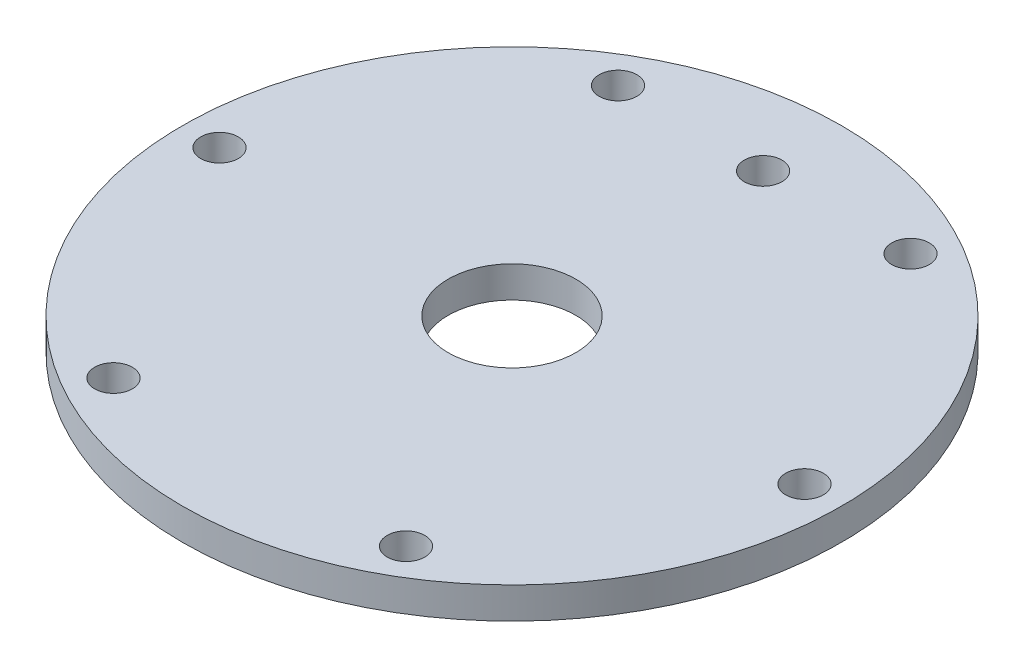
ISO-10303-21;
HEADER;
FILE_DESCRIPTION(('STEP AP214'),'2;1');
FILE_NAME('part.step','',(''),(''),'','','');
FILE_SCHEMA(('AUTOMOTIVE_DESIGN { 1 0 10303 214 1 1 1 1 }'));
ENDSEC;
DATA;
#1=APPLICATION_CONTEXT('core data for automotive mechanical design processes');
#2=APPLICATION_PROTOCOL_DEFINITION('international standard','automotive_design',2000,#1);
#3=PRODUCT_CONTEXT('',#1,'mechanical');
#4=PRODUCT('Part','Part','',(#3));
#5=PRODUCT_RELATED_PRODUCT_CATEGORY('part','',(#4));
#6=PRODUCT_DEFINITION_FORMATION('','',#4);
#7=PRODUCT_DEFINITION_CONTEXT('part definition',#1,'design');
#8=PRODUCT_DEFINITION('design','',#6,#7);
#9=PRODUCT_DEFINITION_SHAPE('','',#8);
#10=(LENGTH_UNIT() NAMED_UNIT(*) SI_UNIT(.MILLI.,.METRE.));
#11=(NAMED_UNIT(*) PLANE_ANGLE_UNIT() SI_UNIT($,.RADIAN.));
#12=(NAMED_UNIT(*) SI_UNIT($,.STERADIAN.) SOLID_ANGLE_UNIT());
#13=UNCERTAINTY_MEASURE_WITH_UNIT(LENGTH_MEASURE(1.E-05),#10,'distance_accuracy_value','');
#14=(GEOMETRIC_REPRESENTATION_CONTEXT(3) GLOBAL_UNCERTAINTY_ASSIGNED_CONTEXT((#13)) GLOBAL_UNIT_ASSIGNED_CONTEXT((#10,
#11,#12)) REPRESENTATION_CONTEXT('',''));
#15=CARTESIAN_POINT('',(0.,0.,0.));
#16=DIRECTION('',(0.,0.,1.));
#17=DIRECTION('',(1.,0.,0.));
#18=AXIS2_PLACEMENT_3D('',#15,#16,#17);
#19=CARTESIAN_POINT('',(0.,10.,0.));
#20=DIRECTION('',(0.,1.,0.));
#21=DIRECTION('',(0.,0.,1.));
#22=AXIS2_PLACEMENT_3D('',#19,#20,#21);
#23=PLANE('',#22);
#24=CARTESIAN_POINT('',(0.,10.,-80.));
#25=DIRECTION('',(0.,1.,0.));
#26=DIRECTION('',(0.,0.,1.));
#27=AXIS2_PLACEMENT_3D('',#24,#25,#26);
#28=CIRCLE('',#27,6.00000000000001);
#29=CARTESIAN_POINT('',(0.,10.,-74.));
#30=VERTEX_POINT('',#29);
#31=EDGE_CURVE('E90',#30,#30,#28,.T.);
#32=ORIENTED_EDGE('',*,*,#31,.F.);
#33=EDGE_LOOP('',(#32));
#34=FACE_BOUND('',#33,.T.);
#35=CARTESIAN_POINT('',(-93.0015510100497,10.,0.192929613181632));
#36=DIRECTION('',(0.,1.,0.));
#37=DIRECTION('',(0.86602540378444,0.,0.499999999999998));
#38=AXIS2_PLACEMENT_3D('',#35,#36,#37);
#39=CIRCLE('',#38,6.00000000000116);
#40=CARTESIAN_POINT('',(-87.8053985873421,10.,3.1929296131822));
#41=VERTEX_POINT('',#40);
#42=EDGE_CURVE('E85',#41,#41,#39,.T.);
#43=ORIENTED_EDGE('',*,*,#42,.F.);
#44=EDGE_LOOP('',(#43));
#45=FACE_BOUND('',#44,.T.);
#46=CARTESIAN_POINT('',(46.6678574511857,10.,80.4452409594724));
#47=DIRECTION('',(0.,1.,0.));
#48=DIRECTION('',(0.86602540378444,0.,0.499999999999998));
#49=AXIS2_PLACEMENT_3D('',#46,#47,#48);
#50=CIRCLE('',#49,5.99999999999494);
#51=CARTESIAN_POINT('',(51.864009873888,10.,83.4452409594699));
#52=VERTEX_POINT('',#51);
#53=EDGE_CURVE('E78',#52,#52,#50,.T.);
#54=ORIENTED_EDGE('',*,*,#53,.F.);
#55=EDGE_LOOP('',(#54));
#56=FACE_BOUND('',#55,.T.);
#57=CARTESIAN_POINT('',(46.333693558874,10.,-80.6381705726481));
#58=DIRECTION('',(0.,1.,0.));
#59=DIRECTION('',(0.86602540378444,0.,0.499999999999998));
#60=AXIS2_PLACEMENT_3D('',#57,#58,#59);
#61=CIRCLE('',#60,6.);
#62=CARTESIAN_POINT('',(51.5298459815806,10.,-77.6381705726481));
#63=VERTEX_POINT('',#62);
#64=EDGE_CURVE('E72',#63,#63,#61,.T.);
#65=ORIENTED_EDGE('',*,*,#64,.F.);
#66=EDGE_LOOP('',(#65));
#67=FACE_BOUND('',#66,.T.);
#68=CARTESIAN_POINT('',(93.001551010053,10.,-0.192929613175522));
#69=DIRECTION('',(0.,1.,0.));
#70=DIRECTION('',(0.,0.,1.));
#71=AXIS2_PLACEMENT_3D('',#68,#69,#70);
#72=CIRCLE('',#71,6.);
#73=CARTESIAN_POINT('',(93.001551010053,10.,5.80707038682448));
#74=VERTEX_POINT('',#73);
#75=EDGE_CURVE('E67',#74,#74,#72,.T.);
#76=ORIENTED_EDGE('',*,*,#75,.F.);
#77=EDGE_LOOP('',(#76));
#78=FACE_BOUND('',#77,.T.);
#79=CARTESIAN_POINT('',(-46.6678574511823,10.,-80.4452409594667));
#80=DIRECTION('',(0.,1.,0.));
#81=DIRECTION('',(0.,0.,1.));
#82=AXIS2_PLACEMENT_3D('',#79,#80,#81);
#83=CIRCLE('',#82,6.00000000000116);
#84=CARTESIAN_POINT('',(-46.6678574511823,10.,-74.4452409594655));
#85=VERTEX_POINT('',#84);
#86=EDGE_CURVE('E64',#85,#85,#83,.T.);
#87=ORIENTED_EDGE('',*,*,#86,.F.);
#88=EDGE_LOOP('',(#87));
#89=FACE_BOUND('',#88,.T.);
#90=CARTESIAN_POINT('',(-46.3336935588709,10.,80.6381705726538));
#91=DIRECTION('',(0.,1.,0.));
#92=DIRECTION('',(0.,0.,1.));
#93=AXIS2_PLACEMENT_3D('',#90,#91,#92);
#94=CIRCLE('',#93,5.99999999999494);
#95=CARTESIAN_POINT('',(-46.3336935588709,10.,86.6381705726488));
#96=VERTEX_POINT('',#95);
#97=EDGE_CURVE('E57',#96,#96,#94,.T.);
#98=ORIENTED_EDGE('',*,*,#97,.F.);
#99=EDGE_LOOP('',(#98));
#100=FACE_BOUND('',#99,.T.);
#101=CARTESIAN_POINT('',(0.,10.,0.));
#102=DIRECTION('',(0.,1.,0.));
#103=DIRECTION('',(0.,0.,1.));
#104=AXIS2_PLACEMENT_3D('',#101,#102,#103);
#105=CIRCLE('',#104,105.);
#106=CARTESIAN_POINT('',(0.,10.,105.));
#107=VERTEX_POINT('',#106);
#108=EDGE_CURVE('E10',#107,#107,#105,.T.);
#109=ORIENTED_EDGE('',*,*,#108,.T.);
#110=EDGE_LOOP('',(#109));
#111=FACE_BOUND('',#110,.T.);
#112=CARTESIAN_POINT('',(0.,10.,0.));
#113=DIRECTION('',(0.,1.,0.));
#114=DIRECTION('',(0.,0.,1.));
#115=AXIS2_PLACEMENT_3D('',#112,#113,#114);
#116=CIRCLE('',#115,20.325);
#117=CARTESIAN_POINT('',(0.,10.,20.325));
#118=VERTEX_POINT('',#117);
#119=EDGE_CURVE('E46',#118,#118,#116,.T.);
#120=ORIENTED_EDGE('',*,*,#119,.F.);
#121=EDGE_LOOP('',(#120));
#122=FACE_BOUND('',#121,.T.);
#123=ADVANCED_FACE('F35',(#34,#45,#56,#67,#78,#89,#100,#111,#122),#23,.T.);
#124=CARTESIAN_POINT('',(0.,0.,0.));
#125=DIRECTION('',(0.,1.,0.));
#126=DIRECTION('',(0.,0.,1.));
#127=AXIS2_PLACEMENT_3D('',#124,#125,#126);
#128=PLANE('',#127);
#129=CARTESIAN_POINT('',(0.,0.,-80.));
#130=DIRECTION('',(0.,1.,0.));
#131=DIRECTION('',(0.,0.,1.));
#132=AXIS2_PLACEMENT_3D('',#129,#130,#131);
#133=CIRCLE('',#132,6.00000000000001);
#134=CARTESIAN_POINT('',(0.,0.,-74.));
#135=VERTEX_POINT('',#134);
#136=EDGE_CURVE('E82',#135,#135,#133,.T.);
#137=ORIENTED_EDGE('',*,*,#136,.T.);
#138=EDGE_LOOP('',(#137));
#139=FACE_BOUND('',#138,.T.);
#140=CARTESIAN_POINT('',(-93.0015510100497,0.,0.192929613181632));
#141=DIRECTION('',(0.,1.,0.));
#142=DIRECTION('',(0.86602540378444,0.,0.499999999999998));
#143=AXIS2_PLACEMENT_3D('',#140,#141,#142);
#144=CIRCLE('',#143,6.00000000000116);
#145=CARTESIAN_POINT('',(-87.8053985873421,0.,3.1929296131822));
#146=VERTEX_POINT('',#145);
#147=EDGE_CURVE('E75',#146,#146,#144,.T.);
#148=ORIENTED_EDGE('',*,*,#147,.T.);
#149=EDGE_LOOP('',(#148));
#150=FACE_BOUND('',#149,.T.);
#151=CARTESIAN_POINT('',(46.6678574511857,0.,80.4452409594724));
#152=DIRECTION('',(0.,1.,0.));
#153=DIRECTION('',(0.86602540378444,0.,0.499999999999998));
#154=AXIS2_PLACEMENT_3D('',#151,#152,#153);
#155=CIRCLE('',#154,5.99999999999494);
#156=CARTESIAN_POINT('',(51.864009873888,0.,83.4452409594699));
#157=VERTEX_POINT('',#156);
#158=EDGE_CURVE('E81',#157,#157,#155,.T.);
#159=ORIENTED_EDGE('',*,*,#158,.T.);
#160=EDGE_LOOP('',(#159));
#161=FACE_BOUND('',#160,.T.);
#162=CARTESIAN_POINT('',(46.333693558874,0.,-80.6381705726481));
#163=DIRECTION('',(0.,1.,0.));
#164=DIRECTION('',(0.86602540378444,0.,0.499999999999998));
#165=AXIS2_PLACEMENT_3D('',#162,#163,#164);
#166=CIRCLE('',#165,6.);
#167=CARTESIAN_POINT('',(51.5298459815806,0.,-77.6381705726481));
#168=VERTEX_POINT('',#167);
#169=EDGE_CURVE('E58',#168,#168,#166,.T.);
#170=ORIENTED_EDGE('',*,*,#169,.T.);
#171=EDGE_LOOP('',(#170));
#172=FACE_BOUND('',#171,.T.);
#173=CARTESIAN_POINT('',(93.001551010053,0.,-0.192929613175522));
#174=DIRECTION('',(0.,1.,0.));
#175=DIRECTION('',(0.,0.,1.));
#176=AXIS2_PLACEMENT_3D('',#173,#174,#175);
#177=CIRCLE('',#176,6.);
#178=CARTESIAN_POINT('',(93.001551010053,0.,5.80707038682448));
#179=VERTEX_POINT('',#178);
#180=EDGE_CURVE('E51',#179,#179,#177,.T.);
#181=ORIENTED_EDGE('',*,*,#180,.T.);
#182=EDGE_LOOP('',(#181));
#183=FACE_BOUND('',#182,.T.);
#184=CARTESIAN_POINT('',(-46.6678574511823,0.,-80.4452409594667));
#185=DIRECTION('',(0.,1.,0.));
#186=DIRECTION('',(0.,0.,1.));
#187=AXIS2_PLACEMENT_3D('',#184,#185,#186);
#188=CIRCLE('',#187,6.00000000000116);
#189=CARTESIAN_POINT('',(-46.6678574511823,0.,-74.4452409594655));
#190=VERTEX_POINT('',#189);
#191=EDGE_CURVE('E61',#190,#190,#188,.T.);
#192=ORIENTED_EDGE('',*,*,#191,.T.);
#193=EDGE_LOOP('',(#192));
#194=FACE_BOUND('',#193,.T.);
#195=CARTESIAN_POINT('',(-46.3336935588709,0.,80.6381705726538));
#196=DIRECTION('',(0.,1.,0.));
#197=DIRECTION('',(0.,0.,1.));
#198=AXIS2_PLACEMENT_3D('',#195,#196,#197);
#199=CIRCLE('',#198,5.99999999999494);
#200=CARTESIAN_POINT('',(-46.3336935588709,0.,86.6381705726488));
#201=VERTEX_POINT('',#200);
#202=EDGE_CURVE('E54',#201,#201,#199,.T.);
#203=ORIENTED_EDGE('',*,*,#202,.T.);
#204=EDGE_LOOP('',(#203));
#205=FACE_BOUND('',#204,.T.);
#206=CARTESIAN_POINT('',(0.,0.,0.));
#207=DIRECTION('',(0.,1.,0.));
#208=DIRECTION('',(0.,0.,1.));
#209=AXIS2_PLACEMENT_3D('',#206,#207,#208);
#210=CIRCLE('',#209,105.);
#211=CARTESIAN_POINT('',(0.,0.,105.));
#212=VERTEX_POINT('',#211);
#213=EDGE_CURVE('E39',#212,#212,#210,.T.);
#214=ORIENTED_EDGE('',*,*,#213,.F.);
#215=EDGE_LOOP('',(#214));
#216=FACE_BOUND('',#215,.T.);
#217=CARTESIAN_POINT('',(0.,0.,0.));
#218=DIRECTION('',(0.,1.,0.));
#219=DIRECTION('',(0.,0.,1.));
#220=AXIS2_PLACEMENT_3D('',#217,#218,#219);
#221=CIRCLE('',#220,20.325);
#222=CARTESIAN_POINT('',(0.,0.,20.325));
#223=VERTEX_POINT('',#222);
#224=EDGE_CURVE('E48',#223,#223,#221,.T.);
#225=ORIENTED_EDGE('',*,*,#224,.T.);
#226=EDGE_LOOP('',(#225));
#227=FACE_BOUND('',#226,.T.);
#228=ADVANCED_FACE('F96',(#139,#150,#161,#172,#183,#194,#205,#216,#227),#128,.F.);
#229=CARTESIAN_POINT('',(0.,10.,0.));
#230=DIRECTION('',(0.,-1.,0.));
#231=DIRECTION('',(0.,0.,-1.));
#232=AXIS2_PLACEMENT_3D('',#229,#230,#231);
#233=CYLINDRICAL_SURFACE('',#232,105.);
#234=ORIENTED_EDGE('',*,*,#108,.F.);
#235=EDGE_LOOP('',(#234));
#236=FACE_BOUND('',#235,.T.);
#237=ORIENTED_EDGE('',*,*,#213,.T.);
#238=EDGE_LOOP('',(#237));
#239=FACE_BOUND('',#238,.T.);
#240=ADVANCED_FACE('F37',(#236,#239),#233,.T.);
#241=CARTESIAN_POINT('',(0.,10.,0.));
#242=DIRECTION('',(0.,-1.,0.));
#243=DIRECTION('',(0.,0.,-1.));
#244=AXIS2_PLACEMENT_3D('',#241,#242,#243);
#245=CYLINDRICAL_SURFACE('',#244,20.325);
#246=ORIENTED_EDGE('',*,*,#119,.T.);
#247=EDGE_LOOP('',(#246));
#248=FACE_BOUND('',#247,.T.);
#249=ORIENTED_EDGE('',*,*,#224,.F.);
#250=EDGE_LOOP('',(#249));
#251=FACE_BOUND('',#250,.T.);
#252=ADVANCED_FACE('F123',(#248,#251),#245,.F.);
#253=CARTESIAN_POINT('',(-46.3336935588709,0.,80.6381705726538));
#254=DIRECTION('',(0.,1.,0.));
#255=DIRECTION('',(0.,0.,1.));
#256=AXIS2_PLACEMENT_3D('',#253,#254,#255);
#257=CYLINDRICAL_SURFACE('',#256,5.99999999999494);
#258=ORIENTED_EDGE('',*,*,#202,.F.);
#259=EDGE_LOOP('',(#258));
#260=FACE_BOUND('',#259,.T.);
#261=ORIENTED_EDGE('',*,*,#97,.T.);
#262=EDGE_LOOP('',(#261));
#263=FACE_BOUND('',#262,.T.);
#264=ADVANCED_FACE('F126',(#260,#263),#257,.F.);
#265=CARTESIAN_POINT('',(-46.6678574511823,0.,-80.4452409594667));
#266=DIRECTION('',(0.,1.,0.));
#267=DIRECTION('',(0.,0.,1.));
#268=AXIS2_PLACEMENT_3D('',#265,#266,#267);
#269=CYLINDRICAL_SURFACE('',#268,6.00000000000116);
#270=ORIENTED_EDGE('',*,*,#191,.F.);
#271=EDGE_LOOP('',(#270));
#272=FACE_BOUND('',#271,.T.);
#273=ORIENTED_EDGE('',*,*,#86,.T.);
#274=EDGE_LOOP('',(#273));
#275=FACE_BOUND('',#274,.T.);
#276=ADVANCED_FACE('F138',(#272,#275),#269,.F.);
#277=CARTESIAN_POINT('',(93.001551010053,0.,-0.192929613175522));
#278=DIRECTION('',(0.,1.,0.));
#279=DIRECTION('',(0.,0.,1.));
#280=AXIS2_PLACEMENT_3D('',#277,#278,#279);
#281=CYLINDRICAL_SURFACE('',#280,6.);
#282=ORIENTED_EDGE('',*,*,#180,.F.);
#283=EDGE_LOOP('',(#282));
#284=FACE_BOUND('',#283,.T.);
#285=ORIENTED_EDGE('',*,*,#75,.T.);
#286=EDGE_LOOP('',(#285));
#287=FACE_BOUND('',#286,.T.);
#288=ADVANCED_FACE('F142',(#284,#287),#281,.F.);
#289=CARTESIAN_POINT('',(46.333693558874,0.,-80.6381705726481));
#290=DIRECTION('',(0.,1.,0.));
#291=DIRECTION('',(0.,0.,1.));
#292=AXIS2_PLACEMENT_3D('',#289,#290,#291);
#293=CYLINDRICAL_SURFACE('',#292,6.);
#294=ORIENTED_EDGE('',*,*,#169,.F.);
#295=EDGE_LOOP('',(#294));
#296=FACE_BOUND('',#295,.T.);
#297=ORIENTED_EDGE('',*,*,#64,.T.);
#298=EDGE_LOOP('',(#297));
#299=FACE_BOUND('',#298,.T.);
#300=ADVANCED_FACE('F146',(#296,#299),#293,.F.);
#301=CARTESIAN_POINT('',(46.6678574511857,0.,80.4452409594724));
#302=DIRECTION('',(0.,1.,0.));
#303=DIRECTION('',(0.,0.,1.));
#304=AXIS2_PLACEMENT_3D('',#301,#302,#303);
#305=CYLINDRICAL_SURFACE('',#304,5.99999999999494);
#306=ORIENTED_EDGE('',*,*,#158,.F.);
#307=EDGE_LOOP('',(#306));
#308=FACE_BOUND('',#307,.T.);
#309=ORIENTED_EDGE('',*,*,#53,.T.);
#310=EDGE_LOOP('',(#309));
#311=FACE_BOUND('',#310,.T.);
#312=ADVANCED_FACE('F150',(#308,#311),#305,.F.);
#313=CARTESIAN_POINT('',(-93.0015510100497,0.,0.192929613181632));
#314=DIRECTION('',(0.,1.,0.));
#315=DIRECTION('',(0.,0.,1.));
#316=AXIS2_PLACEMENT_3D('',#313,#314,#315);
#317=CYLINDRICAL_SURFACE('',#316,6.00000000000116);
#318=ORIENTED_EDGE('',*,*,#147,.F.);
#319=EDGE_LOOP('',(#318));
#320=FACE_BOUND('',#319,.T.);
#321=ORIENTED_EDGE('',*,*,#42,.T.);
#322=EDGE_LOOP('',(#321));
#323=FACE_BOUND('',#322,.T.);
#324=ADVANCED_FACE('F102',(#320,#323),#317,.F.);
#325=CARTESIAN_POINT('',(0.,0.,-80.));
#326=DIRECTION('',(0.,1.,0.));
#327=DIRECTION('',(0.,0.,1.));
#328=AXIS2_PLACEMENT_3D('',#325,#326,#327);
#329=CYLINDRICAL_SURFACE('',#328,6.00000000000001);
#330=ORIENTED_EDGE('',*,*,#136,.F.);
#331=EDGE_LOOP('',(#330));
#332=FACE_BOUND('',#331,.T.);
#333=ORIENTED_EDGE('',*,*,#31,.T.);
#334=EDGE_LOOP('',(#333));
#335=FACE_BOUND('',#334,.T.);
#336=ADVANCED_FACE('F99',(#332,#335),#329,.F.);
#337=CLOSED_SHELL('',(#123,#228,#240,#252,#264,#276,#288,#300,#312,#324,#336));
#338=MANIFOLD_SOLID_BREP('B2',#337);
#339=ADVANCED_BREP_SHAPE_REPRESENTATION('',(#18,#338),#14);
#340=SHAPE_DEFINITION_REPRESENTATION(#9,#339);
ENDSEC;
END-ISO-10303-21;
